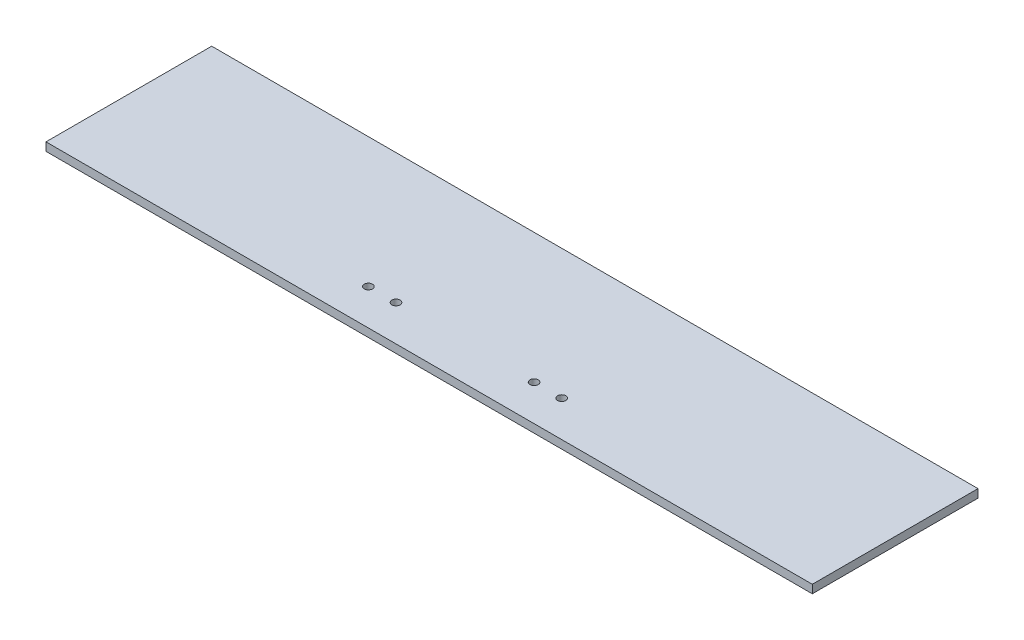
ISO-10303-21;
HEADER;
FILE_DESCRIPTION(('STEP AP214'),'2;1');
FILE_NAME('part.step','',(''),(''),'','','');
FILE_SCHEMA(('AUTOMOTIVE_DESIGN { 1 0 10303 214 1 1 1 1 }'));
ENDSEC;
DATA;
#1=APPLICATION_CONTEXT('core data for automotive mechanical design processes');
#2=APPLICATION_PROTOCOL_DEFINITION('international standard','automotive_design',2000,#1);
#3=PRODUCT_CONTEXT('',#1,'mechanical');
#4=PRODUCT('Part','Part','',(#3));
#5=PRODUCT_RELATED_PRODUCT_CATEGORY('part','',(#4));
#6=PRODUCT_DEFINITION_FORMATION('','',#4);
#7=PRODUCT_DEFINITION_CONTEXT('part definition',#1,'design');
#8=PRODUCT_DEFINITION('design','',#6,#7);
#9=PRODUCT_DEFINITION_SHAPE('','',#8);
#10=(LENGTH_UNIT() NAMED_UNIT(*) SI_UNIT(.MILLI.,.METRE.));
#11=(NAMED_UNIT(*) PLANE_ANGLE_UNIT() SI_UNIT($,.RADIAN.));
#12=(NAMED_UNIT(*) SI_UNIT($,.STERADIAN.) SOLID_ANGLE_UNIT());
#13=UNCERTAINTY_MEASURE_WITH_UNIT(LENGTH_MEASURE(1.E-05),#10,'distance_accuracy_value','');
#14=(GEOMETRIC_REPRESENTATION_CONTEXT(3) GLOBAL_UNCERTAINTY_ASSIGNED_CONTEXT((#13)) GLOBAL_UNIT_ASSIGNED_CONTEXT((#10,
#11,#12)) REPRESENTATION_CONTEXT('',''));
#15=CARTESIAN_POINT('',(0.,0.,0.));
#16=DIRECTION('',(0.,0.,1.));
#17=DIRECTION('',(1.,0.,0.));
#18=AXIS2_PLACEMENT_3D('',#15,#16,#17);
#19=CARTESIAN_POINT('',(138.75,3.,-30.));
#20=DIRECTION('',(-1.,0.,0.));
#21=DIRECTION('',(0.,0.,1.));
#22=AXIS2_PLACEMENT_3D('',#19,#20,#21);
#23=PLANE('',#22);
#24=DIRECTION('',(0.,0.,-1.));
#25=VECTOR('',#24,1.);
#26=CARTESIAN_POINT('',(138.75,0.,-30.));
#27=LINE('',#26,#25);
#28=CARTESIAN_POINT('',(138.75,0.,30.));
#29=VERTEX_POINT('',#28);
#30=CARTESIAN_POINT('',(138.75,0.,-30.));
#31=VERTEX_POINT('',#30);
#32=EDGE_CURVE('E109',#29,#31,#27,.T.);
#33=ORIENTED_EDGE('',*,*,#32,.T.);
#34=DIRECTION('',(0.,-1.,0.));
#35=VECTOR('',#34,1.);
#36=CARTESIAN_POINT('',(138.75,3.,-30.));
#37=LINE('',#36,#35);
#38=CARTESIAN_POINT('',(138.75,3.,-30.));
#39=VERTEX_POINT('',#38);
#40=EDGE_CURVE('E11',#39,#31,#37,.T.);
#41=ORIENTED_EDGE('',*,*,#40,.F.);
#42=DIRECTION('',(0.,0.,-1.));
#43=VECTOR('',#42,1.);
#44=CARTESIAN_POINT('',(138.75,3.,-30.));
#45=LINE('',#44,#43);
#46=CARTESIAN_POINT('',(138.75,3.,30.));
#47=VERTEX_POINT('',#46);
#48=EDGE_CURVE('E93',#47,#39,#45,.T.);
#49=ORIENTED_EDGE('',*,*,#48,.F.);
#50=DIRECTION('',(0.,-1.,0.));
#51=VECTOR('',#50,1.);
#52=CARTESIAN_POINT('',(138.75,3.,30.));
#53=LINE('',#52,#51);
#54=EDGE_CURVE('E105',#47,#29,#53,.T.);
#55=ORIENTED_EDGE('',*,*,#54,.T.);
#56=EDGE_LOOP('',(#33,#41,#49,#55));
#57=FACE_BOUND('',#56,.T.);
#58=ADVANCED_FACE('F41',(#57),#23,.F.);
#59=CARTESIAN_POINT('',(-138.75,3.,-30.));
#60=DIRECTION('',(0.,0.,1.));
#61=DIRECTION('',(1.,0.,0.));
#62=AXIS2_PLACEMENT_3D('',#59,#60,#61);
#63=PLANE('',#62);
#64=DIRECTION('',(-1.,0.,0.));
#65=VECTOR('',#64,1.);
#66=CARTESIAN_POINT('',(-138.75,0.,-30.));
#67=LINE('',#66,#65);
#68=CARTESIAN_POINT('',(-138.75,0.,-30.));
#69=VERTEX_POINT('',#68);
#70=EDGE_CURVE('E98',#31,#69,#67,.T.);
#71=ORIENTED_EDGE('',*,*,#70,.T.);
#72=DIRECTION('',(0.,-1.,0.));
#73=VECTOR('',#72,1.);
#74=CARTESIAN_POINT('',(-138.75,3.,-30.));
#75=LINE('',#74,#73);
#76=CARTESIAN_POINT('',(-138.75,3.,-30.));
#77=VERTEX_POINT('',#76);
#78=EDGE_CURVE('E50',#77,#69,#75,.T.);
#79=ORIENTED_EDGE('',*,*,#78,.F.);
#80=DIRECTION('',(-1.,0.,0.));
#81=VECTOR('',#80,1.);
#82=CARTESIAN_POINT('',(-138.75,3.,-30.));
#83=LINE('',#82,#81);
#84=EDGE_CURVE('E88',#39,#77,#83,.T.);
#85=ORIENTED_EDGE('',*,*,#84,.F.);
#86=ORIENTED_EDGE('',*,*,#40,.T.);
#87=EDGE_LOOP('',(#71,#79,#85,#86));
#88=FACE_BOUND('',#87,.T.);
#89=ADVANCED_FACE('F97',(#88),#63,.F.);
#90=CARTESIAN_POINT('',(-138.75,3.,-30.));
#91=DIRECTION('',(1.,0.,0.));
#92=DIRECTION('',(0.,0.,-1.));
#93=AXIS2_PLACEMENT_3D('',#90,#91,#92);
#94=PLANE('',#93);
#95=DIRECTION('',(0.,0.,1.));
#96=VECTOR('',#95,1.);
#97=CARTESIAN_POINT('',(-138.75,0.,-30.));
#98=LINE('',#97,#96);
#99=CARTESIAN_POINT('',(-138.75,0.,30.));
#100=VERTEX_POINT('',#99);
#101=EDGE_CURVE('E75',#69,#100,#98,.T.);
#102=ORIENTED_EDGE('',*,*,#101,.T.);
#103=DIRECTION('',(0.,-1.,0.));
#104=VECTOR('',#103,1.);
#105=CARTESIAN_POINT('',(-138.75,3.,30.));
#106=LINE('',#105,#104);
#107=CARTESIAN_POINT('',(-138.75,3.,30.));
#108=VERTEX_POINT('',#107);
#109=EDGE_CURVE('E100',#108,#100,#106,.T.);
#110=ORIENTED_EDGE('',*,*,#109,.F.);
#111=DIRECTION('',(0.,0.,1.));
#112=VECTOR('',#111,1.);
#113=CARTESIAN_POINT('',(-138.75,3.,-30.));
#114=LINE('',#113,#112);
#115=EDGE_CURVE('E91',#77,#108,#114,.T.);
#116=ORIENTED_EDGE('',*,*,#115,.F.);
#117=ORIENTED_EDGE('',*,*,#78,.T.);
#118=EDGE_LOOP('',(#102,#110,#116,#117));
#119=FACE_BOUND('',#118,.T.);
#120=ADVANCED_FACE('F101',(#119),#94,.F.);
#121=CARTESIAN_POINT('',(-138.75,3.,30.));
#122=DIRECTION('',(0.,0.,-1.));
#123=DIRECTION('',(-1.,0.,0.));
#124=AXIS2_PLACEMENT_3D('',#121,#122,#123);
#125=PLANE('',#124);
#126=DIRECTION('',(1.,0.,0.));
#127=VECTOR('',#126,1.);
#128=CARTESIAN_POINT('',(-138.75,0.,30.));
#129=LINE('',#128,#127);
#130=EDGE_CURVE('E81',#100,#29,#129,.T.);
#131=ORIENTED_EDGE('',*,*,#130,.T.);
#132=ORIENTED_EDGE('',*,*,#54,.F.);
#133=DIRECTION('',(1.,0.,0.));
#134=VECTOR('',#133,1.);
#135=CARTESIAN_POINT('',(-138.75,3.,30.));
#136=LINE('',#135,#134);
#137=EDGE_CURVE('E58',#108,#47,#136,.T.);
#138=ORIENTED_EDGE('',*,*,#137,.F.);
#139=ORIENTED_EDGE('',*,*,#109,.T.);
#140=EDGE_LOOP('',(#131,#132,#138,#139));
#141=FACE_BOUND('',#140,.T.);
#142=ADVANCED_FACE('F123',(#141),#125,.F.);
#143=CARTESIAN_POINT('',(0.,3.,0.));
#144=DIRECTION('',(0.,1.,0.));
#145=DIRECTION('',(0.,0.,1.));
#146=AXIS2_PLACEMENT_3D('',#143,#144,#145);
#147=PLANE('',#146);
#148=CARTESIAN_POINT('',(35.,3.,17.));
#149=DIRECTION('',(0.,1.,0.));
#150=DIRECTION('',(0.,0.,1.));
#151=AXIS2_PLACEMENT_3D('',#148,#149,#150);
#152=CIRCLE('',#151,1.5);
#153=CARTESIAN_POINT('',(35.,3.,18.5));
#154=VERTEX_POINT('',#153);
#155=EDGE_CURVE('E147',#154,#154,#152,.T.);
#156=ORIENTED_EDGE('',*,*,#155,.F.);
#157=EDGE_LOOP('',(#156));
#158=FACE_BOUND('',#157,.T.);
#159=CARTESIAN_POINT('',(-35.,3.,17.));
#160=DIRECTION('',(0.,1.,0.));
#161=DIRECTION('',(0.,0.,-1.));
#162=AXIS2_PLACEMENT_3D('',#159,#160,#161);
#163=CIRCLE('',#162,1.5);
#164=CARTESIAN_POINT('',(-35.,3.,15.5));
#165=VERTEX_POINT('',#164);
#166=EDGE_CURVE('E138',#165,#165,#163,.T.);
#167=ORIENTED_EDGE('',*,*,#166,.F.);
#168=EDGE_LOOP('',(#167));
#169=FACE_BOUND('',#168,.T.);
#170=CARTESIAN_POINT('',(-25.,3.,17.));
#171=DIRECTION('',(0.,1.,0.));
#172=DIRECTION('',(0.,0.,-1.));
#173=AXIS2_PLACEMENT_3D('',#170,#171,#172);
#174=CIRCLE('',#173,1.5);
#175=CARTESIAN_POINT('',(-25.,3.,15.5));
#176=VERTEX_POINT('',#175);
#177=EDGE_CURVE('E154',#176,#176,#174,.T.);
#178=ORIENTED_EDGE('',*,*,#177,.F.);
#179=EDGE_LOOP('',(#178));
#180=FACE_BOUND('',#179,.T.);
#181=CARTESIAN_POINT('',(25.,3.,17.));
#182=DIRECTION('',(0.,1.,0.));
#183=DIRECTION('',(0.,0.,1.));
#184=AXIS2_PLACEMENT_3D('',#181,#182,#183);
#185=CIRCLE('',#184,1.5);
#186=CARTESIAN_POINT('',(25.,3.,18.5));
#187=VERTEX_POINT('',#186);
#188=EDGE_CURVE('E130',#187,#187,#185,.T.);
#189=ORIENTED_EDGE('',*,*,#188,.F.);
#190=EDGE_LOOP('',(#189));
#191=FACE_BOUND('',#190,.T.);
#192=ORIENTED_EDGE('',*,*,#48,.T.);
#193=ORIENTED_EDGE('',*,*,#84,.T.);
#194=ORIENTED_EDGE('',*,*,#115,.T.);
#195=ORIENTED_EDGE('',*,*,#137,.T.);
#196=EDGE_LOOP('',(#192,#193,#194,#195));
#197=FACE_BOUND('',#196,.T.);
#198=ADVANCED_FACE('F89',(#158,#169,#180,#191,#197),#147,.T.);
#199=CARTESIAN_POINT('',(0.,0.,0.));
#200=DIRECTION('',(0.,1.,0.));
#201=DIRECTION('',(0.,0.,1.));
#202=AXIS2_PLACEMENT_3D('',#199,#200,#201);
#203=PLANE('',#202);
#204=CARTESIAN_POINT('',(35.,0.,17.));
#205=DIRECTION('',(0.,1.,0.));
#206=DIRECTION('',(0.,0.,1.));
#207=AXIS2_PLACEMENT_3D('',#204,#205,#206);
#208=CIRCLE('',#207,1.5);
#209=CARTESIAN_POINT('',(35.,0.,18.5));
#210=VERTEX_POINT('',#209);
#211=EDGE_CURVE('E134',#210,#210,#208,.T.);
#212=ORIENTED_EDGE('',*,*,#211,.T.);
#213=EDGE_LOOP('',(#212));
#214=FACE_BOUND('',#213,.T.);
#215=CARTESIAN_POINT('',(-35.,0.,17.));
#216=DIRECTION('',(0.,1.,0.));
#217=DIRECTION('',(0.,0.,-1.));
#218=AXIS2_PLACEMENT_3D('',#215,#216,#217);
#219=CIRCLE('',#218,1.5);
#220=CARTESIAN_POINT('',(-35.,0.,15.5));
#221=VERTEX_POINT('',#220);
#222=EDGE_CURVE('E142',#221,#221,#219,.T.);
#223=ORIENTED_EDGE('',*,*,#222,.T.);
#224=EDGE_LOOP('',(#223));
#225=FACE_BOUND('',#224,.T.);
#226=CARTESIAN_POINT('',(-25.,0.,17.));
#227=DIRECTION('',(0.,1.,0.));
#228=DIRECTION('',(0.,0.,-1.));
#229=AXIS2_PLACEMENT_3D('',#226,#227,#228);
#230=CIRCLE('',#229,1.5);
#231=CARTESIAN_POINT('',(-25.,0.,15.5));
#232=VERTEX_POINT('',#231);
#233=EDGE_CURVE('E143',#232,#232,#230,.T.);
#234=ORIENTED_EDGE('',*,*,#233,.T.);
#235=EDGE_LOOP('',(#234));
#236=FACE_BOUND('',#235,.T.);
#237=CARTESIAN_POINT('',(25.,0.,17.));
#238=DIRECTION('',(0.,1.,0.));
#239=DIRECTION('',(0.,0.,1.));
#240=AXIS2_PLACEMENT_3D('',#237,#238,#239);
#241=CIRCLE('',#240,1.5);
#242=CARTESIAN_POINT('',(25.,0.,18.5));
#243=VERTEX_POINT('',#242);
#244=EDGE_CURVE('E113',#243,#243,#241,.T.);
#245=ORIENTED_EDGE('',*,*,#244,.T.);
#246=EDGE_LOOP('',(#245));
#247=FACE_BOUND('',#246,.T.);
#248=ORIENTED_EDGE('',*,*,#32,.F.);
#249=ORIENTED_EDGE('',*,*,#130,.F.);
#250=ORIENTED_EDGE('',*,*,#101,.F.);
#251=ORIENTED_EDGE('',*,*,#70,.F.);
#252=EDGE_LOOP('',(#248,#249,#250,#251));
#253=FACE_BOUND('',#252,.T.);
#254=ADVANCED_FACE('F126',(#214,#225,#236,#247,#253),#203,.F.);
#255=CARTESIAN_POINT('',(25.,0.,17.));
#256=DIRECTION('',(0.,1.,0.));
#257=DIRECTION('',(0.,0.,1.));
#258=AXIS2_PLACEMENT_3D('',#255,#256,#257);
#259=CYLINDRICAL_SURFACE('',#258,1.5);
#260=ORIENTED_EDGE('',*,*,#244,.F.);
#261=EDGE_LOOP('',(#260));
#262=FACE_BOUND('',#261,.T.);
#263=ORIENTED_EDGE('',*,*,#188,.T.);
#264=EDGE_LOOP('',(#263));
#265=FACE_BOUND('',#264,.T.);
#266=ADVANCED_FACE('F168',(#262,#265),#259,.F.);
#267=CARTESIAN_POINT('',(-25.,0.,17.));
#268=DIRECTION('',(0.,1.,0.));
#269=DIRECTION('',(0.,0.,1.));
#270=AXIS2_PLACEMENT_3D('',#267,#268,#269);
#271=CYLINDRICAL_SURFACE('',#270,1.5);
#272=ORIENTED_EDGE('',*,*,#233,.F.);
#273=EDGE_LOOP('',(#272));
#274=FACE_BOUND('',#273,.T.);
#275=ORIENTED_EDGE('',*,*,#177,.T.);
#276=EDGE_LOOP('',(#275));
#277=FACE_BOUND('',#276,.T.);
#278=ADVANCED_FACE('F164',(#274,#277),#271,.F.);
#279=CARTESIAN_POINT('',(-35.,0.,17.));
#280=DIRECTION('',(0.,1.,0.));
#281=DIRECTION('',(0.,0.,1.));
#282=AXIS2_PLACEMENT_3D('',#279,#280,#281);
#283=CYLINDRICAL_SURFACE('',#282,1.5);
#284=ORIENTED_EDGE('',*,*,#222,.F.);
#285=EDGE_LOOP('',(#284));
#286=FACE_BOUND('',#285,.T.);
#287=ORIENTED_EDGE('',*,*,#166,.T.);
#288=EDGE_LOOP('',(#287));
#289=FACE_BOUND('',#288,.T.);
#290=ADVANCED_FACE('F167',(#286,#289),#283,.F.);
#291=CARTESIAN_POINT('',(35.,0.,17.));
#292=DIRECTION('',(0.,1.,0.));
#293=DIRECTION('',(0.,0.,1.));
#294=AXIS2_PLACEMENT_3D('',#291,#292,#293);
#295=CYLINDRICAL_SURFACE('',#294,1.5);
#296=ORIENTED_EDGE('',*,*,#211,.F.);
#297=EDGE_LOOP('',(#296));
#298=FACE_BOUND('',#297,.T.);
#299=ORIENTED_EDGE('',*,*,#155,.T.);
#300=EDGE_LOOP('',(#299));
#301=FACE_BOUND('',#300,.T.);
#302=ADVANCED_FACE('F229',(#298,#301),#295,.F.);
#303=CLOSED_SHELL('',(#58,#89,#120,#142,#198,#254,#266,#278,#290,#302));
#304=MANIFOLD_SOLID_BREP('B2',#303);
#305=ADVANCED_BREP_SHAPE_REPRESENTATION('',(#18,#304),#14);
#306=SHAPE_DEFINITION_REPRESENTATION(#9,#305);
ENDSEC;
END-ISO-10303-21;
